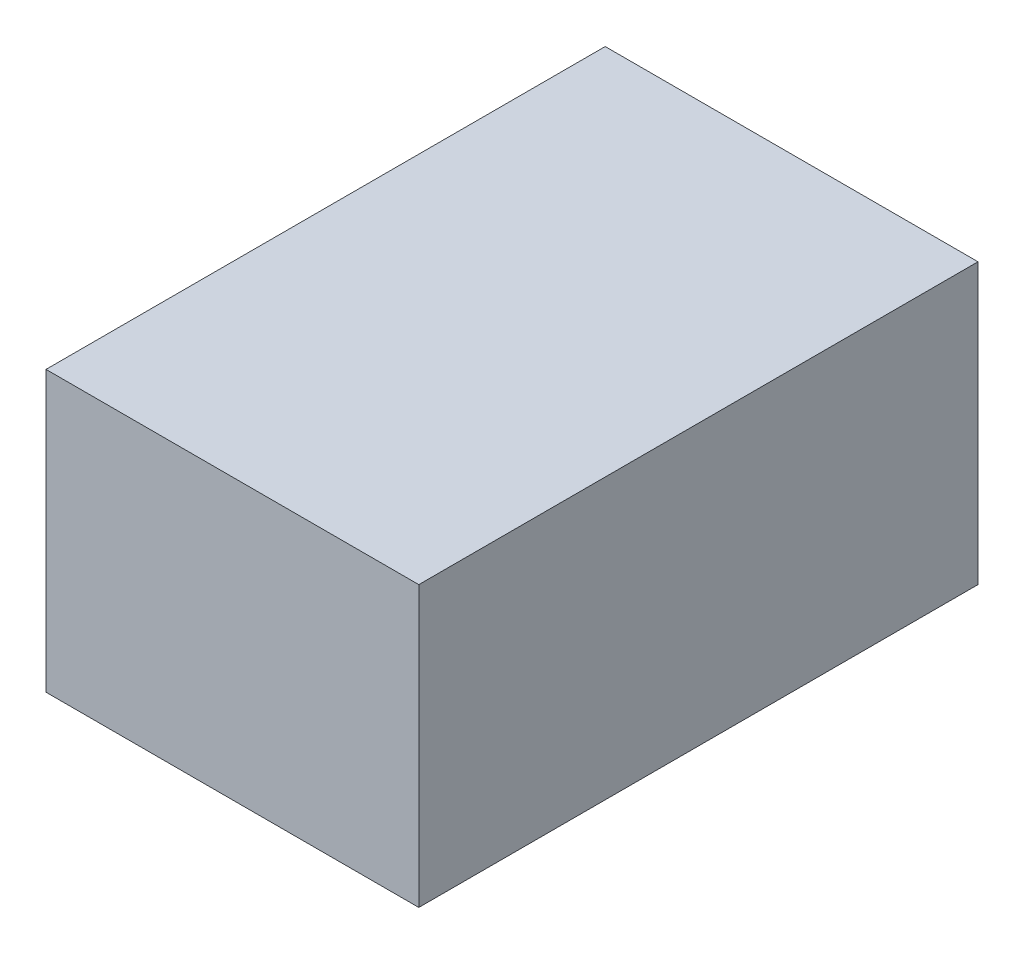
ISO-10303-21;
HEADER;
FILE_DESCRIPTION(('STEP AP214'),'2;1');
FILE_NAME('part.step','',(''),(''),'','','');
FILE_SCHEMA(('AUTOMOTIVE_DESIGN { 1 0 10303 214 1 1 1 1 }'));
ENDSEC;
DATA;
#1=APPLICATION_CONTEXT('core data for automotive mechanical design processes');
#2=APPLICATION_PROTOCOL_DEFINITION('international standard','automotive_design',2000,#1);
#3=PRODUCT_CONTEXT('',#1,'mechanical');
#4=PRODUCT('Part','Part','',(#3));
#5=PRODUCT_RELATED_PRODUCT_CATEGORY('part','',(#4));
#6=PRODUCT_DEFINITION_FORMATION('','',#4);
#7=PRODUCT_DEFINITION_CONTEXT('part definition',#1,'design');
#8=PRODUCT_DEFINITION('design','',#6,#7);
#9=PRODUCT_DEFINITION_SHAPE('','',#8);
#10=(LENGTH_UNIT() NAMED_UNIT(*) SI_UNIT(.MILLI.,.METRE.));
#11=(NAMED_UNIT(*) PLANE_ANGLE_UNIT() SI_UNIT($,.RADIAN.));
#12=(NAMED_UNIT(*) SI_UNIT($,.STERADIAN.) SOLID_ANGLE_UNIT());
#13=UNCERTAINTY_MEASURE_WITH_UNIT(LENGTH_MEASURE(1.E-05),#10,'distance_accuracy_value','');
#14=(GEOMETRIC_REPRESENTATION_CONTEXT(3) GLOBAL_UNCERTAINTY_ASSIGNED_CONTEXT((#13)) GLOBAL_UNIT_ASSIGNED_CONTEXT((#10,
#11,#12)) REPRESENTATION_CONTEXT('',''));
#15=CARTESIAN_POINT('',(0.,0.,0.));
#16=DIRECTION('',(0.,0.,1.));
#17=DIRECTION('',(1.,0.,0.));
#18=AXIS2_PLACEMENT_3D('',#15,#16,#17);
#19=CARTESIAN_POINT('',(0.,457.2,0.));
#20=DIRECTION('',(1.,0.,0.));
#21=DIRECTION('',(0.,0.,-1.));
#22=AXIS2_PLACEMENT_3D('',#19,#20,#21);
#23=PLANE('',#22);
#24=DIRECTION('',(0.,0.,1.));
#25=VECTOR('',#24,1.);
#26=CARTESIAN_POINT('',(0.,0.,0.));
#27=LINE('',#26,#25);
#28=CARTESIAN_POINT('',(0.,0.,-914.4));
#29=VERTEX_POINT('',#28);
#30=CARTESIAN_POINT('',(0.,0.,0.));
#31=VERTEX_POINT('',#30);
#32=EDGE_CURVE('E98',#29,#31,#27,.T.);
#33=ORIENTED_EDGE('',*,*,#32,.T.);
#34=DIRECTION('',(0.,-1.,0.));
#35=VECTOR('',#34,1.);
#36=CARTESIAN_POINT('',(0.,457.2,0.));
#37=LINE('',#36,#35);
#38=CARTESIAN_POINT('',(0.,457.2,0.));
#39=VERTEX_POINT('',#38);
#40=EDGE_CURVE('E11',#39,#31,#37,.T.);
#41=ORIENTED_EDGE('',*,*,#40,.F.);
#42=DIRECTION('',(0.,0.,1.));
#43=VECTOR('',#42,1.);
#44=CARTESIAN_POINT('',(0.,457.2,0.));
#45=LINE('',#44,#43);
#46=CARTESIAN_POINT('',(0.,457.2,-914.4));
#47=VERTEX_POINT('',#46);
#48=EDGE_CURVE('E86',#47,#39,#45,.T.);
#49=ORIENTED_EDGE('',*,*,#48,.F.);
#50=DIRECTION('',(0.,-1.,0.));
#51=VECTOR('',#50,1.);
#52=CARTESIAN_POINT('',(0.,457.2,-914.4));
#53=LINE('',#52,#51);
#54=EDGE_CURVE('E94',#47,#29,#53,.T.);
#55=ORIENTED_EDGE('',*,*,#54,.T.);
#56=EDGE_LOOP('',(#33,#41,#49,#55));
#57=FACE_BOUND('',#56,.T.);
#58=ADVANCED_FACE('F35',(#57),#23,.F.);
#59=CARTESIAN_POINT('',(0.,457.2,0.));
#60=DIRECTION('',(0.,0.,-1.));
#61=DIRECTION('',(-1.,0.,0.));
#62=AXIS2_PLACEMENT_3D('',#59,#60,#61);
#63=PLANE('',#62);
#64=DIRECTION('',(1.,0.,0.));
#65=VECTOR('',#64,1.);
#66=CARTESIAN_POINT('',(0.,0.,0.));
#67=LINE('',#66,#65);
#68=CARTESIAN_POINT('',(609.6,0.,0.));
#69=VERTEX_POINT('',#68);
#70=EDGE_CURVE('E90',#31,#69,#67,.T.);
#71=ORIENTED_EDGE('',*,*,#70,.T.);
#72=DIRECTION('',(0.,-1.,0.));
#73=VECTOR('',#72,1.);
#74=CARTESIAN_POINT('',(609.6,457.2,0.));
#75=LINE('',#74,#73);
#76=CARTESIAN_POINT('',(609.6,457.2,0.));
#77=VERTEX_POINT('',#76);
#78=EDGE_CURVE('E43',#77,#69,#75,.T.);
#79=ORIENTED_EDGE('',*,*,#78,.F.);
#80=DIRECTION('',(1.,0.,0.));
#81=VECTOR('',#80,1.);
#82=CARTESIAN_POINT('',(0.,457.2,0.));
#83=LINE('',#82,#81);
#84=EDGE_CURVE('E81',#39,#77,#83,.T.);
#85=ORIENTED_EDGE('',*,*,#84,.F.);
#86=ORIENTED_EDGE('',*,*,#40,.T.);
#87=EDGE_LOOP('',(#71,#79,#85,#86));
#88=FACE_BOUND('',#87,.T.);
#89=ADVANCED_FACE('F89',(#88),#63,.F.);
#90=CARTESIAN_POINT('',(609.6,457.2,0.));
#91=DIRECTION('',(-1.,0.,0.));
#92=DIRECTION('',(0.,0.,1.));
#93=AXIS2_PLACEMENT_3D('',#90,#91,#92);
#94=PLANE('',#93);
#95=DIRECTION('',(0.,0.,-1.));
#96=VECTOR('',#95,1.);
#97=CARTESIAN_POINT('',(609.6,0.,0.));
#98=LINE('',#97,#96);
#99=CARTESIAN_POINT('',(609.6,0.,-914.4));
#100=VERTEX_POINT('',#99);
#101=EDGE_CURVE('E68',#69,#100,#98,.T.);
#102=ORIENTED_EDGE('',*,*,#101,.T.);
#103=DIRECTION('',(0.,-1.,0.));
#104=VECTOR('',#103,1.);
#105=CARTESIAN_POINT('',(609.6,457.2,-914.4));
#106=LINE('',#105,#104);
#107=CARTESIAN_POINT('',(609.6,457.2,-914.4));
#108=VERTEX_POINT('',#107);
#109=EDGE_CURVE('E91',#108,#100,#106,.T.);
#110=ORIENTED_EDGE('',*,*,#109,.F.);
#111=DIRECTION('',(0.,0.,-1.));
#112=VECTOR('',#111,1.);
#113=CARTESIAN_POINT('',(609.6,457.2,0.));
#114=LINE('',#113,#112);
#115=EDGE_CURVE('E84',#77,#108,#114,.T.);
#116=ORIENTED_EDGE('',*,*,#115,.F.);
#117=ORIENTED_EDGE('',*,*,#78,.T.);
#118=EDGE_LOOP('',(#102,#110,#116,#117));
#119=FACE_BOUND('',#118,.T.);
#120=ADVANCED_FACE('F92',(#119),#94,.F.);
#121=CARTESIAN_POINT('',(0.,457.2,-914.4));
#122=DIRECTION('',(0.,0.,1.));
#123=DIRECTION('',(1.,0.,0.));
#124=AXIS2_PLACEMENT_3D('',#121,#122,#123);
#125=PLANE('',#124);
#126=DIRECTION('',(-1.,0.,0.));
#127=VECTOR('',#126,1.);
#128=CARTESIAN_POINT('',(0.,0.,-914.4));
#129=LINE('',#128,#127);
#130=EDGE_CURVE('E74',#100,#29,#129,.T.);
#131=ORIENTED_EDGE('',*,*,#130,.T.);
#132=ORIENTED_EDGE('',*,*,#54,.F.);
#133=DIRECTION('',(-1.,0.,0.));
#134=VECTOR('',#133,1.);
#135=CARTESIAN_POINT('',(0.,457.2,-914.4));
#136=LINE('',#135,#134);
#137=EDGE_CURVE('E51',#108,#47,#136,.T.);
#138=ORIENTED_EDGE('',*,*,#137,.F.);
#139=ORIENTED_EDGE('',*,*,#109,.T.);
#140=EDGE_LOOP('',(#131,#132,#138,#139));
#141=FACE_BOUND('',#140,.T.);
#142=ADVANCED_FACE('F105',(#141),#125,.F.);
#143=CARTESIAN_POINT('',(0.,457.2,0.));
#144=DIRECTION('',(0.,-1.,0.));
#145=DIRECTION('',(0.,0.,-1.));
#146=AXIS2_PLACEMENT_3D('',#143,#144,#145);
#147=PLANE('',#146);
#148=ORIENTED_EDGE('',*,*,#48,.T.);
#149=ORIENTED_EDGE('',*,*,#84,.T.);
#150=ORIENTED_EDGE('',*,*,#115,.T.);
#151=ORIENTED_EDGE('',*,*,#137,.T.);
#152=EDGE_LOOP('',(#148,#149,#150,#151));
#153=FACE_BOUND('',#152,.T.);
#154=ADVANCED_FACE('F82',(#153),#147,.F.);
#155=CARTESIAN_POINT('',(0.,0.,0.));
#156=DIRECTION('',(0.,-1.,0.));
#157=DIRECTION('',(0.,0.,-1.));
#158=AXIS2_PLACEMENT_3D('',#155,#156,#157);
#159=PLANE('',#158);
#160=ORIENTED_EDGE('',*,*,#32,.F.);
#161=ORIENTED_EDGE('',*,*,#130,.F.);
#162=ORIENTED_EDGE('',*,*,#101,.F.);
#163=ORIENTED_EDGE('',*,*,#70,.F.);
#164=EDGE_LOOP('',(#160,#161,#162,#163));
#165=FACE_BOUND('',#164,.T.);
#166=ADVANCED_FACE('F108',(#165),#159,.T.);
#167=CLOSED_SHELL('',(#58,#89,#120,#142,#154,#166));
#168=MANIFOLD_SOLID_BREP('B2',#167);
#169=ADVANCED_BREP_SHAPE_REPRESENTATION('',(#18,#168),#14);
#170=SHAPE_DEFINITION_REPRESENTATION(#9,#169);
ENDSEC;
END-ISO-10303-21;
